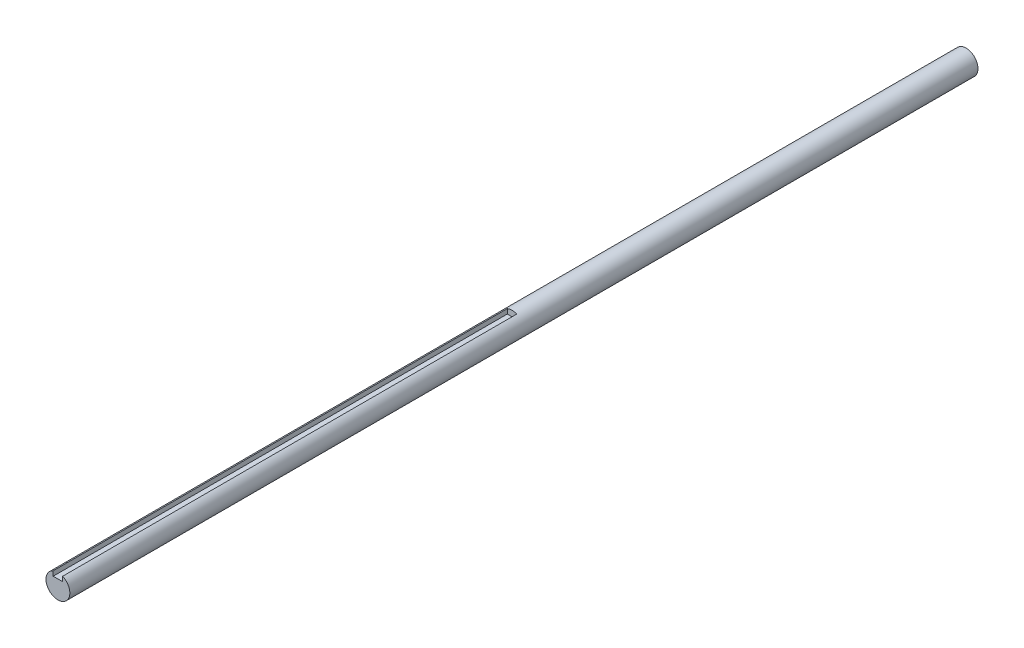
ISO-10303-21;
HEADER;
FILE_DESCRIPTION(('STEP AP214'),'2;1');
FILE_NAME('part.step','',(''),(''),'','','');
FILE_SCHEMA(('AUTOMOTIVE_DESIGN { 1 0 10303 214 1 1 1 1 }'));
ENDSEC;
DATA;
#1=APPLICATION_CONTEXT('core data for automotive mechanical design processes');
#2=APPLICATION_PROTOCOL_DEFINITION('international standard','automotive_design',2000,#1);
#3=PRODUCT_CONTEXT('',#1,'mechanical');
#4=PRODUCT('Part','Part','',(#3));
#5=PRODUCT_RELATED_PRODUCT_CATEGORY('part','',(#4));
#6=PRODUCT_DEFINITION_FORMATION('','',#4);
#7=PRODUCT_DEFINITION_CONTEXT('part definition',#1,'design');
#8=PRODUCT_DEFINITION('design','',#6,#7);
#9=PRODUCT_DEFINITION_SHAPE('','',#8);
#10=(LENGTH_UNIT() NAMED_UNIT(*) SI_UNIT(.MILLI.,.METRE.));
#11=(NAMED_UNIT(*) PLANE_ANGLE_UNIT() SI_UNIT($,.RADIAN.));
#12=(NAMED_UNIT(*) SI_UNIT($,.STERADIAN.) SOLID_ANGLE_UNIT());
#13=UNCERTAINTY_MEASURE_WITH_UNIT(LENGTH_MEASURE(1.E-05),#10,'distance_accuracy_value','');
#14=(GEOMETRIC_REPRESENTATION_CONTEXT(3) GLOBAL_UNCERTAINTY_ASSIGNED_CONTEXT((#13)) GLOBAL_UNIT_ASSIGNED_CONTEXT((#10,
#11,#12)) REPRESENTATION_CONTEXT('',''));
#15=CARTESIAN_POINT('',(0.,0.,0.));
#16=DIRECTION('',(0.,0.,1.));
#17=DIRECTION('',(1.,0.,0.));
#18=AXIS2_PLACEMENT_3D('',#15,#16,#17);
#19=CARTESIAN_POINT('',(0.,0.,76.2));
#20=DIRECTION('',(0.,0.,1.));
#21=DIRECTION('',(1.,0.,0.));
#22=AXIS2_PLACEMENT_3D('',#19,#20,#21);
#23=PLANE('',#22);
#24=CARTESIAN_POINT('',(0.,0.,76.2));
#25=DIRECTION('',(0.,0.,1.));
#26=DIRECTION('',(1.,0.,0.));
#27=AXIS2_PLACEMENT_3D('',#24,#25,#26);
#28=CIRCLE('',#27,2.);
#29=CARTESIAN_POINT('',(0.79375,1.83574533568793,76.2));
#30=VERTEX_POINT('',#29);
#31=CARTESIAN_POINT('',(-0.79375,1.83574533568793,76.2));
#32=VERTEX_POINT('',#31);
#33=EDGE_CURVE('E11',#30,#32,#28,.T.);
#34=ORIENTED_EDGE('',*,*,#33,.T.);
#35=DIRECTION('',(0.,-1.,0.));
#36=VECTOR('',#35,1.);
#37=CARTESIAN_POINT('',(-0.79375,1.83574533568793,76.2));
#38=LINE('',#37,#36);
#39=CARTESIAN_POINT('',(-0.79375,1.0475,76.2));
#40=VERTEX_POINT('',#39);
#41=EDGE_CURVE('E54',#32,#40,#38,.T.);
#42=ORIENTED_EDGE('',*,*,#41,.T.);
#43=DIRECTION('',(1.,0.,0.));
#44=VECTOR('',#43,1.);
#45=CARTESIAN_POINT('',(-0.79375,1.0475,76.2));
#46=LINE('',#45,#44);
#47=CARTESIAN_POINT('',(0.79375,1.0475,76.2));
#48=VERTEX_POINT('',#47);
#49=EDGE_CURVE('E83',#40,#48,#46,.T.);
#50=ORIENTED_EDGE('',*,*,#49,.T.);
#51=DIRECTION('',(0.,-1.,0.));
#52=VECTOR('',#51,1.);
#53=CARTESIAN_POINT('',(0.79375,1.83574533568793,76.2));
#54=LINE('',#53,#52);
#55=EDGE_CURVE('E103',#30,#48,#54,.T.);
#56=ORIENTED_EDGE('',*,*,#55,.F.);
#57=EDGE_LOOP('',(#34,#42,#50,#56));
#58=FACE_BOUND('',#57,.T.);
#59=ADVANCED_FACE('F39',(#58),#23,.T.);
#60=CARTESIAN_POINT('',(0.,0.,76.2));
#61=DIRECTION('',(0.,0.,-1.));
#62=DIRECTION('',(-1.,0.,0.));
#63=AXIS2_PLACEMENT_3D('',#60,#61,#62);
#64=CYLINDRICAL_SURFACE('',#63,2.);
#65=ORIENTED_EDGE('',*,*,#33,.F.);
#66=DIRECTION('',(0.,0.,-1.));
#67=VECTOR('',#66,1.);
#68=CARTESIAN_POINT('',(0.793749999999999,1.83574533568793,152.4));
#69=LINE('',#68,#67);
#70=CARTESIAN_POINT('',(0.793749999999999,1.83574533568793,152.4));
#71=VERTEX_POINT('',#70);
#72=EDGE_CURVE('E119',#71,#30,#69,.T.);
#73=ORIENTED_EDGE('',*,*,#72,.F.);
#74=CARTESIAN_POINT('',(0.,0.,152.4));
#75=DIRECTION('',(0.,0.,1.));
#76=DIRECTION('',(1.,0.,0.));
#77=AXIS2_PLACEMENT_3D('',#74,#75,#76);
#78=CIRCLE('',#77,2.);
#79=CARTESIAN_POINT('',(-0.79375,1.83574533568793,152.4));
#80=VERTEX_POINT('',#79);
#81=EDGE_CURVE('E88',#80,#71,#78,.T.);
#82=ORIENTED_EDGE('',*,*,#81,.F.);
#83=DIRECTION('',(0.,0.,-1.));
#84=VECTOR('',#83,1.);
#85=CARTESIAN_POINT('',(-0.79375,1.83574533568793,152.4));
#86=LINE('',#85,#84);
#87=EDGE_CURVE('E100',#80,#32,#86,.T.);
#88=ORIENTED_EDGE('',*,*,#87,.T.);
#89=EDGE_LOOP('',(#65,#73,#82,#88));
#90=FACE_BOUND('',#89,.T.);
#91=CARTESIAN_POINT('',(0.,0.,0.));
#92=DIRECTION('',(0.,0.,1.));
#93=DIRECTION('',(1.,0.,0.));
#94=AXIS2_PLACEMENT_3D('',#91,#92,#93);
#95=CIRCLE('',#94,2.);
#96=CARTESIAN_POINT('',(2.,0.,0.));
#97=VERTEX_POINT('',#96);
#98=EDGE_CURVE('E43',#97,#97,#95,.T.);
#99=ORIENTED_EDGE('',*,*,#98,.T.);
#100=EDGE_LOOP('',(#99));
#101=FACE_BOUND('',#100,.T.);
#102=ADVANCED_FACE('F41',(#90,#101),#64,.T.);
#103=CARTESIAN_POINT('',(0.,0.,0.));
#104=DIRECTION('',(0.,0.,1.));
#105=DIRECTION('',(1.,0.,0.));
#106=AXIS2_PLACEMENT_3D('',#103,#104,#105);
#107=PLANE('',#106);
#108=ORIENTED_EDGE('',*,*,#98,.F.);
#109=EDGE_LOOP('',(#108));
#110=FACE_BOUND('',#109,.T.);
#111=ADVANCED_FACE('F130',(#110),#107,.F.);
#112=CARTESIAN_POINT('',(-0.79375,1.83574533568793,152.4));
#113=DIRECTION('',(1.,0.,0.));
#114=DIRECTION('',(0.,1.,0.));
#115=AXIS2_PLACEMENT_3D('',#112,#113,#114);
#116=PLANE('',#115);
#117=ORIENTED_EDGE('',*,*,#41,.F.);
#118=ORIENTED_EDGE('',*,*,#87,.F.);
#119=DIRECTION('',(0.,-1.,0.));
#120=VECTOR('',#119,1.);
#121=CARTESIAN_POINT('',(-0.79375,1.83574533568793,152.4));
#122=LINE('',#121,#120);
#123=CARTESIAN_POINT('',(-0.79375,1.0475,152.4));
#124=VERTEX_POINT('',#123);
#125=EDGE_CURVE('E93',#80,#124,#122,.T.);
#126=ORIENTED_EDGE('',*,*,#125,.T.);
#127=DIRECTION('',(0.,0.,-1.));
#128=VECTOR('',#127,1.);
#129=CARTESIAN_POINT('',(-0.79375,1.0475,152.4));
#130=LINE('',#129,#128);
#131=EDGE_CURVE('E78',#124,#40,#130,.T.);
#132=ORIENTED_EDGE('',*,*,#131,.T.);
#133=EDGE_LOOP('',(#117,#118,#126,#132));
#134=FACE_BOUND('',#133,.T.);
#135=ADVANCED_FACE('F99',(#134),#116,.T.);
#136=CARTESIAN_POINT('',(0.79375,1.83574533568793,152.4));
#137=DIRECTION('',(1.,0.,0.));
#138=DIRECTION('',(0.,1.,0.));
#139=AXIS2_PLACEMENT_3D('',#136,#137,#138);
#140=PLANE('',#139);
#141=ORIENTED_EDGE('',*,*,#55,.T.);
#142=DIRECTION('',(0.,0.,-1.));
#143=VECTOR('',#142,1.);
#144=CARTESIAN_POINT('',(0.79375,1.0475,152.4));
#145=LINE('',#144,#143);
#146=CARTESIAN_POINT('',(0.79375,1.0475,152.4));
#147=VERTEX_POINT('',#146);
#148=EDGE_CURVE('E87',#147,#48,#145,.T.);
#149=ORIENTED_EDGE('',*,*,#148,.F.);
#150=DIRECTION('',(0.,-1.,0.));
#151=VECTOR('',#150,1.);
#152=CARTESIAN_POINT('',(0.79375,1.83574533568793,152.4));
#153=LINE('',#152,#151);
#154=EDGE_CURVE('E95',#71,#147,#153,.T.);
#155=ORIENTED_EDGE('',*,*,#154,.F.);
#156=ORIENTED_EDGE('',*,*,#72,.T.);
#157=EDGE_LOOP('',(#141,#149,#155,#156));
#158=FACE_BOUND('',#157,.T.);
#159=ADVANCED_FACE('F125',(#158),#140,.F.);
#160=CARTESIAN_POINT('',(-0.79375,1.0475,152.4));
#161=DIRECTION('',(0.,1.,0.));
#162=DIRECTION('',(0.,0.,1.));
#163=AXIS2_PLACEMENT_3D('',#160,#161,#162);
#164=PLANE('',#163);
#165=ORIENTED_EDGE('',*,*,#49,.F.);
#166=ORIENTED_EDGE('',*,*,#131,.F.);
#167=DIRECTION('',(1.,0.,0.));
#168=VECTOR('',#167,1.);
#169=CARTESIAN_POINT('',(-0.79375,1.0475,152.4));
#170=LINE('',#169,#168);
#171=EDGE_CURVE('E82',#124,#147,#170,.T.);
#172=ORIENTED_EDGE('',*,*,#171,.T.);
#173=ORIENTED_EDGE('',*,*,#148,.T.);
#174=EDGE_LOOP('',(#165,#166,#172,#173));
#175=FACE_BOUND('',#174,.T.);
#176=ADVANCED_FACE('F80',(#175),#164,.T.);
#177=CARTESIAN_POINT('',(0.,0.,152.4));
#178=DIRECTION('',(0.,0.,1.));
#179=DIRECTION('',(1.,0.,0.));
#180=AXIS2_PLACEMENT_3D('',#177,#178,#179);
#181=PLANE('',#180);
#182=ORIENTED_EDGE('',*,*,#125,.F.);
#183=ORIENTED_EDGE('',*,*,#81,.T.);
#184=ORIENTED_EDGE('',*,*,#154,.T.);
#185=ORIENTED_EDGE('',*,*,#171,.F.);
#186=EDGE_LOOP('',(#182,#183,#184,#185));
#187=FACE_BOUND('',#186,.T.);
#188=ADVANCED_FACE('F92',(#187),#181,.T.);
#189=CLOSED_SHELL('',(#59,#102,#111,#135,#159,#176,#188));
#190=MANIFOLD_SOLID_BREP('B2',#189);
#191=ADVANCED_BREP_SHAPE_REPRESENTATION('',(#18,#190),#14);
#192=SHAPE_DEFINITION_REPRESENTATION(#9,#191);
ENDSEC;
END-ISO-10303-21;
